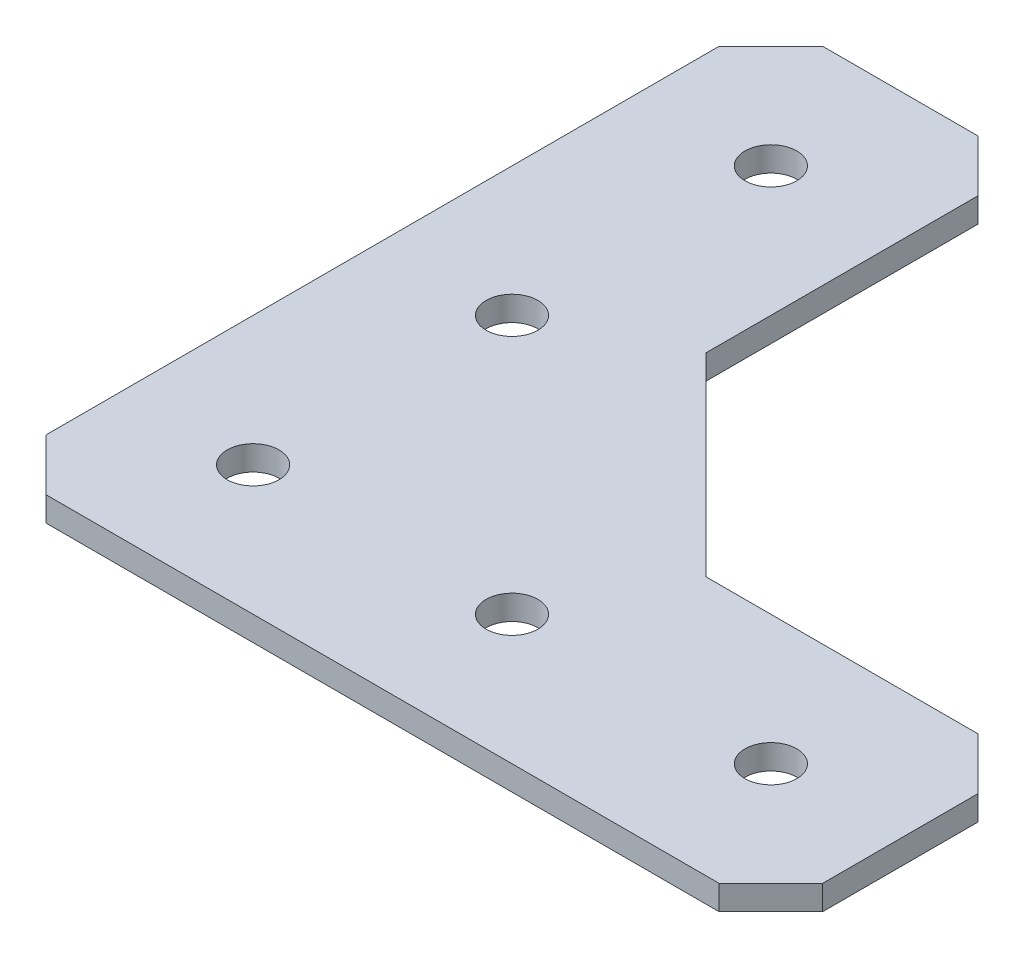
ISO-10303-21;
HEADER;
FILE_DESCRIPTION(('STEP AP214'),'2;1');
FILE_NAME('part.step','',(''),(''),'','','');
FILE_SCHEMA(('AUTOMOTIVE_DESIGN { 1 0 10303 214 1 1 1 1 }'));
ENDSEC;
DATA;
#1=APPLICATION_CONTEXT('core data for automotive mechanical design processes');
#2=APPLICATION_PROTOCOL_DEFINITION('international standard','automotive_design',2000,#1);
#3=PRODUCT_CONTEXT('',#1,'mechanical');
#4=PRODUCT('Part','Part','',(#3));
#5=PRODUCT_RELATED_PRODUCT_CATEGORY('part','',(#4));
#6=PRODUCT_DEFINITION_FORMATION('','',#4);
#7=PRODUCT_DEFINITION_CONTEXT('part definition',#1,'design');
#8=PRODUCT_DEFINITION('design','',#6,#7);
#9=PRODUCT_DEFINITION_SHAPE('','',#8);
#10=(LENGTH_UNIT() NAMED_UNIT(*) SI_UNIT(.MILLI.,.METRE.));
#11=(NAMED_UNIT(*) PLANE_ANGLE_UNIT() SI_UNIT($,.RADIAN.));
#12=(NAMED_UNIT(*) SI_UNIT($,.STERADIAN.) SOLID_ANGLE_UNIT());
#13=UNCERTAINTY_MEASURE_WITH_UNIT(LENGTH_MEASURE(1.E-05),#10,'distance_accuracy_value','');
#14=(GEOMETRIC_REPRESENTATION_CONTEXT(3) GLOBAL_UNCERTAINTY_ASSIGNED_CONTEXT((#13)) GLOBAL_UNIT_ASSIGNED_CONTEXT((#10,
#11,#12)) REPRESENTATION_CONTEXT('',''));
#15=CARTESIAN_POINT('',(0.,0.,0.));
#16=DIRECTION('',(0.,0.,1.));
#17=DIRECTION('',(1.,0.,0.));
#18=AXIS2_PLACEMENT_3D('',#15,#16,#17);
#19=CARTESIAN_POINT('',(0.,2.413,0.));
#20=DIRECTION('',(1.,0.,0.));
#21=DIRECTION('',(0.,0.,-1.));
#22=AXIS2_PLACEMENT_3D('',#19,#20,#21);
#23=PLANE('',#22);
#24=DIRECTION('',(0.,0.,1.));
#25=VECTOR('',#24,1.);
#26=CARTESIAN_POINT('',(0.,2.413,0.));
#27=LINE('',#26,#25);
#28=CARTESIAN_POINT('',(0.,2.413,-71.12));
#29=VERTEX_POINT('',#28);
#30=CARTESIAN_POINT('',(0.,2.413,-5.08000000000001));
#31=VERTEX_POINT('',#30);
#32=EDGE_CURVE('E161',#29,#31,#27,.T.);
#33=ORIENTED_EDGE('',*,*,#32,.F.);
#34=DIRECTION('',(0.,-1.,0.));
#35=VECTOR('',#34,1.);
#36=CARTESIAN_POINT('',(0.,2.413,-71.12));
#37=LINE('',#36,#35);
#38=CARTESIAN_POINT('',(0.,0.,-71.12));
#39=VERTEX_POINT('',#38);
#40=EDGE_CURVE('E171',#29,#39,#37,.T.);
#41=ORIENTED_EDGE('',*,*,#40,.T.);
#42=DIRECTION('',(0.,0.,1.));
#43=VECTOR('',#42,1.);
#44=CARTESIAN_POINT('',(0.,0.,0.));
#45=LINE('',#44,#43);
#46=CARTESIAN_POINT('',(0.,0.,-5.08000000000001));
#47=VERTEX_POINT('',#46);
#48=EDGE_CURVE('E222',#39,#47,#45,.T.);
#49=ORIENTED_EDGE('',*,*,#48,.T.);
#50=DIRECTION('',(0.,1.,0.));
#51=VECTOR('',#50,1.);
#52=CARTESIAN_POINT('',(0.,2.413,-5.08000000000002));
#53=LINE('',#52,#51);
#54=EDGE_CURVE('E169',#47,#31,#53,.T.);
#55=ORIENTED_EDGE('',*,*,#54,.T.);
#56=EDGE_LOOP('',(#33,#41,#49,#55));
#57=FACE_BOUND('',#56,.T.);
#58=ADVANCED_FACE('F41',(#57),#23,.F.);
#59=CARTESIAN_POINT('',(0.,2.413,0.));
#60=DIRECTION('',(0.,0.,-1.));
#61=DIRECTION('',(-1.,0.,0.));
#62=AXIS2_PLACEMENT_3D('',#59,#60,#61);
#63=PLANE('',#62);
#64=DIRECTION('',(1.,0.,0.));
#65=VECTOR('',#64,1.);
#66=CARTESIAN_POINT('',(0.,0.,0.));
#67=LINE('',#66,#65);
#68=CARTESIAN_POINT('',(5.08,0.,0.));
#69=VERTEX_POINT('',#68);
#70=CARTESIAN_POINT('',(71.12,0.,0.));
#71=VERTEX_POINT('',#70);
#72=EDGE_CURVE('E226',#69,#71,#67,.T.);
#73=ORIENTED_EDGE('',*,*,#72,.T.);
#74=DIRECTION('',(0.,1.,0.));
#75=VECTOR('',#74,1.);
#76=CARTESIAN_POINT('',(71.12,2.413,0.));
#77=LINE('',#76,#75);
#78=CARTESIAN_POINT('',(71.12,2.413,0.));
#79=VERTEX_POINT('',#78);
#80=EDGE_CURVE('E11',#71,#79,#77,.T.);
#81=ORIENTED_EDGE('',*,*,#80,.T.);
#82=DIRECTION('',(1.,0.,0.));
#83=VECTOR('',#82,1.);
#84=CARTESIAN_POINT('',(0.,2.413,0.));
#85=LINE('',#84,#83);
#86=CARTESIAN_POINT('',(5.08,2.413,0.));
#87=VERTEX_POINT('',#86);
#88=EDGE_CURVE('E249',#87,#79,#85,.T.);
#89=ORIENTED_EDGE('',*,*,#88,.F.);
#90=DIRECTION('',(0.,-1.,0.));
#91=VECTOR('',#90,1.);
#92=CARTESIAN_POINT('',(5.08,2.413,0.));
#93=LINE('',#92,#91);
#94=EDGE_CURVE('E51',#87,#69,#93,.T.);
#95=ORIENTED_EDGE('',*,*,#94,.T.);
#96=EDGE_LOOP('',(#73,#81,#89,#95));
#97=FACE_BOUND('',#96,.T.);
#98=ADVANCED_FACE('F299',(#97),#63,.F.);
#99=CARTESIAN_POINT('',(76.2,2.413,0.));
#100=DIRECTION('',(-1.,0.,0.));
#101=DIRECTION('',(0.,0.,1.));
#102=AXIS2_PLACEMENT_3D('',#99,#100,#101);
#103=PLANE('',#102);
#104=DIRECTION('',(0.,0.,-1.));
#105=VECTOR('',#104,1.);
#106=CARTESIAN_POINT('',(76.2,0.,0.));
#107=LINE('',#106,#105);
#108=CARTESIAN_POINT('',(76.2,0.,-5.08));
#109=VERTEX_POINT('',#108);
#110=CARTESIAN_POINT('',(76.2,0.,-20.32));
#111=VERTEX_POINT('',#110);
#112=EDGE_CURVE('E163',#109,#111,#107,.T.);
#113=ORIENTED_EDGE('',*,*,#112,.T.);
#114=DIRECTION('',(0.,1.,0.));
#115=VECTOR('',#114,1.);
#116=CARTESIAN_POINT('',(76.2,2.413,-20.32));
#117=LINE('',#116,#115);
#118=CARTESIAN_POINT('',(76.2,2.413,-20.32));
#119=VERTEX_POINT('',#118);
#120=EDGE_CURVE('E204',#111,#119,#117,.T.);
#121=ORIENTED_EDGE('',*,*,#120,.T.);
#122=DIRECTION('',(0.,0.,-1.));
#123=VECTOR('',#122,1.);
#124=CARTESIAN_POINT('',(76.2,2.413,0.));
#125=LINE('',#124,#123);
#126=CARTESIAN_POINT('',(76.2,2.413,-5.08));
#127=VERTEX_POINT('',#126);
#128=EDGE_CURVE('E247',#127,#119,#125,.T.);
#129=ORIENTED_EDGE('',*,*,#128,.F.);
#130=DIRECTION('',(0.,-1.,0.));
#131=VECTOR('',#130,1.);
#132=CARTESIAN_POINT('',(76.2,2.413,-5.08));
#133=LINE('',#132,#131);
#134=EDGE_CURVE('E201',#127,#109,#133,.T.);
#135=ORIENTED_EDGE('',*,*,#134,.T.);
#136=EDGE_LOOP('',(#113,#121,#129,#135));
#137=FACE_BOUND('',#136,.T.);
#138=ADVANCED_FACE('F238',(#137),#103,.F.);
#139=CARTESIAN_POINT('',(25.4,2.413,-25.4));
#140=DIRECTION('',(0.,0.,1.));
#141=DIRECTION('',(1.,0.,0.));
#142=AXIS2_PLACEMENT_3D('',#139,#140,#141);
#143=PLANE('',#142);
#144=DIRECTION('',(-1.,0.,0.));
#145=VECTOR('',#144,1.);
#146=CARTESIAN_POINT('',(25.4,2.413,-25.4));
#147=LINE('',#146,#145);
#148=CARTESIAN_POINT('',(71.12,2.413,-25.4));
#149=VERTEX_POINT('',#148);
#150=CARTESIAN_POINT('',(44.4499999999999,2.413,-25.4));
#151=VERTEX_POINT('',#150);
#152=EDGE_CURVE('E246',#149,#151,#147,.T.);
#153=ORIENTED_EDGE('',*,*,#152,.F.);
#154=DIRECTION('',(0.,-1.,0.));
#155=VECTOR('',#154,1.);
#156=CARTESIAN_POINT('',(71.12,2.413,-25.4));
#157=LINE('',#156,#155);
#158=CARTESIAN_POINT('',(71.12,0.,-25.4));
#159=VERTEX_POINT('',#158);
#160=EDGE_CURVE('E198',#149,#159,#157,.T.);
#161=ORIENTED_EDGE('',*,*,#160,.T.);
#162=DIRECTION('',(-1.,0.,0.));
#163=VECTOR('',#162,1.);
#164=CARTESIAN_POINT('',(25.4,0.,-25.4));
#165=LINE('',#164,#163);
#166=CARTESIAN_POINT('',(44.4499999999999,0.,-25.4));
#167=VERTEX_POINT('',#166);
#168=EDGE_CURVE('E158',#159,#167,#165,.T.);
#169=ORIENTED_EDGE('',*,*,#168,.T.);
#170=DIRECTION('',(0.,1.,0.));
#171=VECTOR('',#170,1.);
#172=CARTESIAN_POINT('',(44.4499999999999,2.413,-25.4));
#173=LINE('',#172,#171);
#174=EDGE_CURVE('E142',#167,#151,#173,.T.);
#175=ORIENTED_EDGE('',*,*,#174,.T.);
#176=EDGE_LOOP('',(#153,#161,#169,#175));
#177=FACE_BOUND('',#176,.T.);
#178=ADVANCED_FACE('F245',(#177),#143,.F.);
#179=CARTESIAN_POINT('',(25.4,2.413,-76.2));
#180=DIRECTION('',(-1.,0.,0.));
#181=DIRECTION('',(0.,0.,1.));
#182=AXIS2_PLACEMENT_3D('',#179,#180,#181);
#183=PLANE('',#182);
#184=DIRECTION('',(0.,0.,-1.));
#185=VECTOR('',#184,1.);
#186=CARTESIAN_POINT('',(25.4,0.,-76.2));
#187=LINE('',#186,#185);
#188=CARTESIAN_POINT('',(25.4,0.,-44.4500000000001));
#189=VERTEX_POINT('',#188);
#190=CARTESIAN_POINT('',(25.4,0.,-71.12));
#191=VERTEX_POINT('',#190);
#192=EDGE_CURVE('E149',#189,#191,#187,.T.);
#193=ORIENTED_EDGE('',*,*,#192,.T.);
#194=DIRECTION('',(0.,1.,0.));
#195=VECTOR('',#194,1.);
#196=CARTESIAN_POINT('',(25.4,2.413,-71.12));
#197=LINE('',#196,#195);
#198=CARTESIAN_POINT('',(25.4,2.413,-71.12));
#199=VERTEX_POINT('',#198);
#200=EDGE_CURVE('E59',#191,#199,#197,.T.);
#201=ORIENTED_EDGE('',*,*,#200,.T.);
#202=DIRECTION('',(0.,0.,-1.));
#203=VECTOR('',#202,1.);
#204=CARTESIAN_POINT('',(25.4,2.413,-76.2));
#205=LINE('',#204,#203);
#206=CARTESIAN_POINT('',(25.4,2.413,-44.4500000000001));
#207=VERTEX_POINT('',#206);
#208=EDGE_CURVE('E150',#207,#199,#205,.T.);
#209=ORIENTED_EDGE('',*,*,#208,.F.);
#210=DIRECTION('',(0.,-1.,0.));
#211=VECTOR('',#210,1.);
#212=CARTESIAN_POINT('',(25.4,0.,-44.4500000000001));
#213=LINE('',#212,#211);
#214=EDGE_CURVE('E140',#207,#189,#213,.T.);
#215=ORIENTED_EDGE('',*,*,#214,.T.);
#216=EDGE_LOOP('',(#193,#201,#209,#215));
#217=FACE_BOUND('',#216,.T.);
#218=ADVANCED_FACE('F148',(#217),#183,.F.);
#219=CARTESIAN_POINT('',(0.,2.413,-76.2));
#220=DIRECTION('',(0.,0.,1.));
#221=DIRECTION('',(1.,0.,0.));
#222=AXIS2_PLACEMENT_3D('',#219,#220,#221);
#223=PLANE('',#222);
#224=DIRECTION('',(-1.,0.,0.));
#225=VECTOR('',#224,1.);
#226=CARTESIAN_POINT('',(0.,0.,-76.2));
#227=LINE('',#226,#225);
#228=CARTESIAN_POINT('',(20.32,0.,-76.2));
#229=VERTEX_POINT('',#228);
#230=CARTESIAN_POINT('',(5.08000000000002,0.,-76.2));
#231=VERTEX_POINT('',#230);
#232=EDGE_CURVE('E157',#229,#231,#227,.T.);
#233=ORIENTED_EDGE('',*,*,#232,.T.);
#234=DIRECTION('',(0.,1.,0.));
#235=VECTOR('',#234,1.);
#236=CARTESIAN_POINT('',(5.08000000000002,2.413,-76.2));
#237=LINE('',#236,#235);
#238=CARTESIAN_POINT('',(5.08000000000002,2.413,-76.2));
#239=VERTEX_POINT('',#238);
#240=EDGE_CURVE('E186',#231,#239,#237,.T.);
#241=ORIENTED_EDGE('',*,*,#240,.T.);
#242=DIRECTION('',(-1.,0.,0.));
#243=VECTOR('',#242,1.);
#244=CARTESIAN_POINT('',(0.,2.413,-76.2));
#245=LINE('',#244,#243);
#246=CARTESIAN_POINT('',(20.32,2.413,-76.2));
#247=VERTEX_POINT('',#246);
#248=EDGE_CURVE('E151',#247,#239,#245,.T.);
#249=ORIENTED_EDGE('',*,*,#248,.F.);
#250=DIRECTION('',(0.,-1.,0.));
#251=VECTOR('',#250,1.);
#252=CARTESIAN_POINT('',(20.32,2.413,-76.2));
#253=LINE('',#252,#251);
#254=EDGE_CURVE('E183',#247,#229,#253,.T.);
#255=ORIENTED_EDGE('',*,*,#254,.T.);
#256=EDGE_LOOP('',(#233,#241,#249,#255));
#257=FACE_BOUND('',#256,.T.);
#258=ADVANCED_FACE('F276',(#257),#223,.F.);
#259=CARTESIAN_POINT('',(0.,2.413,0.));
#260=DIRECTION('',(0.,-1.,0.));
#261=DIRECTION('',(0.,0.,-1.));
#262=AXIS2_PLACEMENT_3D('',#259,#260,#261);
#263=PLANE('',#262);
#264=CARTESIAN_POINT('',(12.7,2.413,-38.1));
#265=DIRECTION('',(0.,1.,0.));
#266=DIRECTION('',(0.,0.,1.));
#267=AXIS2_PLACEMENT_3D('',#264,#265,#266);
#268=CIRCLE('',#267,2.54);
#269=CARTESIAN_POINT('',(12.7,2.413,-35.56));
#270=VERTEX_POINT('',#269);
#271=EDGE_CURVE('E258',#270,#270,#268,.T.);
#272=ORIENTED_EDGE('',*,*,#271,.F.);
#273=EDGE_LOOP('',(#272));
#274=FACE_BOUND('',#273,.T.);
#275=CARTESIAN_POINT('',(38.1,2.413,-12.7));
#276=DIRECTION('',(0.,1.,0.));
#277=DIRECTION('',(0.,0.,1.));
#278=AXIS2_PLACEMENT_3D('',#275,#276,#277);
#279=CIRCLE('',#278,2.54);
#280=CARTESIAN_POINT('',(38.1,2.413,-10.16));
#281=VERTEX_POINT('',#280);
#282=EDGE_CURVE('E259',#281,#281,#279,.T.);
#283=ORIENTED_EDGE('',*,*,#282,.F.);
#284=EDGE_LOOP('',(#283));
#285=FACE_BOUND('',#284,.T.);
#286=CARTESIAN_POINT('',(12.7,2.413,-63.5));
#287=DIRECTION('',(0.,1.,0.));
#288=DIRECTION('',(0.,0.,1.));
#289=AXIS2_PLACEMENT_3D('',#286,#287,#288);
#290=CIRCLE('',#289,2.54);
#291=CARTESIAN_POINT('',(12.7,2.413,-60.96));
#292=VERTEX_POINT('',#291);
#293=EDGE_CURVE('E262',#292,#292,#290,.T.);
#294=ORIENTED_EDGE('',*,*,#293,.F.);
#295=EDGE_LOOP('',(#294));
#296=FACE_BOUND('',#295,.T.);
#297=CARTESIAN_POINT('',(63.5,2.413,-12.7));
#298=DIRECTION('',(0.,1.,0.));
#299=DIRECTION('',(0.,0.,1.));
#300=AXIS2_PLACEMENT_3D('',#297,#298,#299);
#301=CIRCLE('',#300,2.54);
#302=CARTESIAN_POINT('',(63.5,2.413,-10.16));
#303=VERTEX_POINT('',#302);
#304=EDGE_CURVE('E265',#303,#303,#301,.T.);
#305=ORIENTED_EDGE('',*,*,#304,.F.);
#306=EDGE_LOOP('',(#305));
#307=FACE_BOUND('',#306,.T.);
#308=CARTESIAN_POINT('',(12.7,2.413,-12.7));
#309=DIRECTION('',(0.,1.,0.));
#310=DIRECTION('',(0.,0.,1.));
#311=AXIS2_PLACEMENT_3D('',#308,#309,#310);
#312=CIRCLE('',#311,2.54);
#313=CARTESIAN_POINT('',(12.7,2.413,-10.16));
#314=VERTEX_POINT('',#313);
#315=EDGE_CURVE('E212',#314,#314,#312,.T.);
#316=ORIENTED_EDGE('',*,*,#315,.F.);
#317=EDGE_LOOP('',(#316));
#318=FACE_BOUND('',#317,.T.);
#319=ORIENTED_EDGE('',*,*,#248,.T.);
#320=DIRECTION('',(0.707106781186548,0.,-0.707106781186547));
#321=VECTOR('',#320,1.);
#322=CARTESIAN_POINT('',(0.,2.413,-71.12));
#323=LINE('',#322,#321);
#324=EDGE_CURVE('E195',#239,#29,#323,.F.);
#325=ORIENTED_EDGE('',*,*,#324,.T.);
#326=ORIENTED_EDGE('',*,*,#32,.T.);
#327=DIRECTION('',(-0.707106781186547,0.,-0.707106781186548));
#328=VECTOR('',#327,1.);
#329=CARTESIAN_POINT('',(5.08,2.413,0.));
#330=LINE('',#329,#328);
#331=EDGE_CURVE('E188',#31,#87,#330,.F.);
#332=ORIENTED_EDGE('',*,*,#331,.T.);
#333=ORIENTED_EDGE('',*,*,#88,.T.);
#334=DIRECTION('',(-0.707106781186548,0.,0.707106781186547));
#335=VECTOR('',#334,1.);
#336=CARTESIAN_POINT('',(76.2,2.413,-5.08));
#337=LINE('',#336,#335);
#338=EDGE_CURVE('E190',#79,#127,#337,.F.);
#339=ORIENTED_EDGE('',*,*,#338,.T.);
#340=ORIENTED_EDGE('',*,*,#128,.T.);
#341=DIRECTION('',(0.707106781186547,0.,0.707106781186548));
#342=VECTOR('',#341,1.);
#343=CARTESIAN_POINT('',(71.12,2.413,-25.4));
#344=LINE('',#343,#342);
#345=EDGE_CURVE('E67',#119,#149,#344,.F.);
#346=ORIENTED_EDGE('',*,*,#345,.T.);
#347=ORIENTED_EDGE('',*,*,#152,.T.);
#348=DIRECTION('',(0.707106781186543,0.,0.707106781186552));
#349=VECTOR('',#348,1.);
#350=CARTESIAN_POINT('',(34.9250000000002,2.413,-34.9249999999998));
#351=LINE('',#350,#349);
#352=EDGE_CURVE('E146',#151,#207,#351,.F.);
#353=ORIENTED_EDGE('',*,*,#352,.T.);
#354=ORIENTED_EDGE('',*,*,#208,.T.);
#355=DIRECTION('',(0.707106781186547,0.,0.707106781186548));
#356=VECTOR('',#355,1.);
#357=CARTESIAN_POINT('',(20.32,2.413,-76.2));
#358=LINE('',#357,#356);
#359=EDGE_CURVE('E193',#199,#247,#358,.F.);
#360=ORIENTED_EDGE('',*,*,#359,.T.);
#361=EDGE_LOOP('',(#319,#325,#326,#332,#333,#339,#340,#346,#347,#353,#354,#360));
#362=FACE_BOUND('',#361,.T.);
#363=ADVANCED_FACE('F273',(#274,#285,#296,#307,#318,#362),#263,.F.);
#364=CARTESIAN_POINT('',(0.,0.,0.));
#365=DIRECTION('',(0.,-1.,0.));
#366=DIRECTION('',(0.,0.,-1.));
#367=AXIS2_PLACEMENT_3D('',#364,#365,#366);
#368=PLANE('',#367);
#369=CARTESIAN_POINT('',(12.7,0.,-38.1));
#370=DIRECTION('',(0.,-1.,0.));
#371=DIRECTION('',(0.,0.,-1.));
#372=AXIS2_PLACEMENT_3D('',#369,#370,#371);
#373=CIRCLE('',#372,2.54);
#374=CARTESIAN_POINT('',(12.7,0.,-35.56));
#375=VERTEX_POINT('',#374);
#376=EDGE_CURVE('E46',#375,#375,#373,.T.);
#377=ORIENTED_EDGE('',*,*,#376,.F.);
#378=EDGE_LOOP('',(#377));
#379=FACE_BOUND('',#378,.T.);
#380=CARTESIAN_POINT('',(38.1,0.,-12.7));
#381=DIRECTION('',(0.,-1.,0.));
#382=DIRECTION('',(0.,0.,-1.));
#383=AXIS2_PLACEMENT_3D('',#380,#381,#382);
#384=CIRCLE('',#383,2.54);
#385=CARTESIAN_POINT('',(38.1,0.,-10.16));
#386=VERTEX_POINT('',#385);
#387=EDGE_CURVE('E217',#386,#386,#384,.T.);
#388=ORIENTED_EDGE('',*,*,#387,.F.);
#389=EDGE_LOOP('',(#388));
#390=FACE_BOUND('',#389,.T.);
#391=CARTESIAN_POINT('',(12.7,0.,-63.5));
#392=DIRECTION('',(0.,-1.,0.));
#393=DIRECTION('',(0.,0.,-1.));
#394=AXIS2_PLACEMENT_3D('',#391,#392,#393);
#395=CIRCLE('',#394,2.54);
#396=CARTESIAN_POINT('',(12.7,0.,-60.96));
#397=VERTEX_POINT('',#396);
#398=EDGE_CURVE('E215',#397,#397,#395,.T.);
#399=ORIENTED_EDGE('',*,*,#398,.F.);
#400=EDGE_LOOP('',(#399));
#401=FACE_BOUND('',#400,.T.);
#402=CARTESIAN_POINT('',(63.5,0.,-12.7));
#403=DIRECTION('',(0.,-1.,0.));
#404=DIRECTION('',(0.,0.,-1.));
#405=AXIS2_PLACEMENT_3D('',#402,#403,#404);
#406=CIRCLE('',#405,2.54);
#407=CARTESIAN_POINT('',(63.5,0.,-10.16));
#408=VERTEX_POINT('',#407);
#409=EDGE_CURVE('E211',#408,#408,#406,.T.);
#410=ORIENTED_EDGE('',*,*,#409,.F.);
#411=EDGE_LOOP('',(#410));
#412=FACE_BOUND('',#411,.T.);
#413=CARTESIAN_POINT('',(12.7,0.,-12.7));
#414=DIRECTION('',(0.,-1.,0.));
#415=DIRECTION('',(0.,0.,-1.));
#416=AXIS2_PLACEMENT_3D('',#413,#414,#415);
#417=CIRCLE('',#416,2.54);
#418=CARTESIAN_POINT('',(12.7,0.,-10.16));
#419=VERTEX_POINT('',#418);
#420=EDGE_CURVE('E208',#419,#419,#417,.T.);
#421=ORIENTED_EDGE('',*,*,#420,.F.);
#422=EDGE_LOOP('',(#421));
#423=FACE_BOUND('',#422,.T.);
#424=ORIENTED_EDGE('',*,*,#48,.F.);
#425=DIRECTION('',(-0.707106781186548,0.,0.707106781186547));
#426=VECTOR('',#425,1.);
#427=CARTESIAN_POINT('',(-35.56,0.,-35.5600000000001));
#428=LINE('',#427,#426);
#429=EDGE_CURVE('E181',#39,#231,#428,.F.);
#430=ORIENTED_EDGE('',*,*,#429,.T.);
#431=ORIENTED_EDGE('',*,*,#232,.F.);
#432=DIRECTION('',(-0.707106781186547,0.,-0.707106781186548));
#433=VECTOR('',#432,1.);
#434=CARTESIAN_POINT('',(48.26,0.,-48.2599999999999));
#435=LINE('',#434,#433);
#436=EDGE_CURVE('E156',#229,#191,#435,.F.);
#437=ORIENTED_EDGE('',*,*,#436,.T.);
#438=ORIENTED_EDGE('',*,*,#192,.F.);
#439=DIRECTION('',(-0.707106781186543,0.,-0.707106781186552));
#440=VECTOR('',#439,1.);
#441=CARTESIAN_POINT('',(25.4,0.,-44.4500000000001));
#442=LINE('',#441,#440);
#443=EDGE_CURVE('E136',#189,#167,#442,.F.);
#444=ORIENTED_EDGE('',*,*,#443,.T.);
#445=ORIENTED_EDGE('',*,*,#168,.F.);
#446=DIRECTION('',(-0.707106781186547,0.,-0.707106781186548));
#447=VECTOR('',#446,1.);
#448=CARTESIAN_POINT('',(48.2600000000001,0.,-48.26));
#449=LINE('',#448,#447);
#450=EDGE_CURVE('E178',#159,#111,#449,.F.);
#451=ORIENTED_EDGE('',*,*,#450,.T.);
#452=ORIENTED_EDGE('',*,*,#112,.F.);
#453=DIRECTION('',(0.707106781186548,0.,-0.707106781186547));
#454=VECTOR('',#453,1.);
#455=CARTESIAN_POINT('',(35.5599999999999,0.,35.56));
#456=LINE('',#455,#454);
#457=EDGE_CURVE('E176',#109,#71,#456,.F.);
#458=ORIENTED_EDGE('',*,*,#457,.T.);
#459=ORIENTED_EDGE('',*,*,#72,.F.);
#460=DIRECTION('',(0.707106781186547,0.,0.707106781186548));
#461=VECTOR('',#460,1.);
#462=CARTESIAN_POINT('',(2.54000000000001,0.,-2.54));
#463=LINE('',#462,#461);
#464=EDGE_CURVE('E174',#69,#47,#463,.F.);
#465=ORIENTED_EDGE('',*,*,#464,.T.);
#466=EDGE_LOOP('',(#424,#430,#431,#437,#438,#444,#445,#451,#452,#458,#459,#465));
#467=FACE_BOUND('',#466,.T.);
#468=ADVANCED_FACE('F154',(#379,#390,#401,#412,#423,#467),#368,.T.);
#469=CARTESIAN_POINT('',(25.4,2.413,-44.4500000000001));
#470=DIRECTION('',(0.707106781186552,0.,-0.707106781186543));
#471=DIRECTION('',(0.,1.,0.));
#472=AXIS2_PLACEMENT_3D('',#469,#470,#471);
#473=PLANE('',#472);
#474=ORIENTED_EDGE('',*,*,#352,.F.);
#475=ORIENTED_EDGE('',*,*,#174,.F.);
#476=ORIENTED_EDGE('',*,*,#443,.F.);
#477=ORIENTED_EDGE('',*,*,#214,.F.);
#478=EDGE_LOOP('',(#474,#475,#476,#477));
#479=FACE_BOUND('',#478,.T.);
#480=ADVANCED_FACE('F139',(#479),#473,.T.);
#481=CARTESIAN_POINT('',(0.,2.413,-71.12));
#482=DIRECTION('',(0.707106781186547,0.,0.707106781186548));
#483=DIRECTION('',(0.,-1.,0.));
#484=AXIS2_PLACEMENT_3D('',#481,#482,#483);
#485=PLANE('',#484);
#486=ORIENTED_EDGE('',*,*,#324,.F.);
#487=ORIENTED_EDGE('',*,*,#240,.F.);
#488=ORIENTED_EDGE('',*,*,#429,.F.);
#489=ORIENTED_EDGE('',*,*,#40,.F.);
#490=EDGE_LOOP('',(#486,#487,#488,#489));
#491=FACE_BOUND('',#490,.T.);
#492=ADVANCED_FACE('F292',(#491),#485,.F.);
#493=CARTESIAN_POINT('',(20.32,2.413,-76.2));
#494=DIRECTION('',(-0.707106781186548,0.,0.707106781186547));
#495=DIRECTION('',(0.,-1.,0.));
#496=AXIS2_PLACEMENT_3D('',#493,#494,#495);
#497=PLANE('',#496);
#498=ORIENTED_EDGE('',*,*,#359,.F.);
#499=ORIENTED_EDGE('',*,*,#200,.F.);
#500=ORIENTED_EDGE('',*,*,#436,.F.);
#501=ORIENTED_EDGE('',*,*,#254,.F.);
#502=EDGE_LOOP('',(#498,#499,#500,#501));
#503=FACE_BOUND('',#502,.T.);
#504=ADVANCED_FACE('F310',(#503),#497,.F.);
#505=CARTESIAN_POINT('',(71.12,2.413,-25.4));
#506=DIRECTION('',(-0.707106781186548,0.,0.707106781186547));
#507=DIRECTION('',(0.,-1.,0.));
#508=AXIS2_PLACEMENT_3D('',#505,#506,#507);
#509=PLANE('',#508);
#510=ORIENTED_EDGE('',*,*,#345,.F.);
#511=ORIENTED_EDGE('',*,*,#120,.F.);
#512=ORIENTED_EDGE('',*,*,#450,.F.);
#513=ORIENTED_EDGE('',*,*,#160,.F.);
#514=EDGE_LOOP('',(#510,#511,#512,#513));
#515=FACE_BOUND('',#514,.T.);
#516=ADVANCED_FACE('F242',(#515),#509,.F.);
#517=CARTESIAN_POINT('',(76.2,2.413,-5.08));
#518=DIRECTION('',(-0.707106781186547,0.,-0.707106781186548));
#519=DIRECTION('',(0.,-1.,0.));
#520=AXIS2_PLACEMENT_3D('',#517,#518,#519);
#521=PLANE('',#520);
#522=ORIENTED_EDGE('',*,*,#338,.F.);
#523=ORIENTED_EDGE('',*,*,#80,.F.);
#524=ORIENTED_EDGE('',*,*,#457,.F.);
#525=ORIENTED_EDGE('',*,*,#134,.F.);
#526=EDGE_LOOP('',(#522,#523,#524,#525));
#527=FACE_BOUND('',#526,.T.);
#528=ADVANCED_FACE('F303',(#527),#521,.F.);
#529=CARTESIAN_POINT('',(5.08,2.413,0.));
#530=DIRECTION('',(0.707106781186548,0.,-0.707106781186547));
#531=DIRECTION('',(0.,-1.,0.));
#532=AXIS2_PLACEMENT_3D('',#529,#530,#531);
#533=PLANE('',#532);
#534=ORIENTED_EDGE('',*,*,#331,.F.);
#535=ORIENTED_EDGE('',*,*,#54,.F.);
#536=ORIENTED_EDGE('',*,*,#464,.F.);
#537=ORIENTED_EDGE('',*,*,#94,.F.);
#538=EDGE_LOOP('',(#534,#535,#536,#537));
#539=FACE_BOUND('',#538,.T.);
#540=ADVANCED_FACE('F44',(#539),#533,.F.);
#541=CARTESIAN_POINT('',(12.7,-1.2E-05,-12.7));
#542=DIRECTION('',(0.,1.,0.));
#543=DIRECTION('',(0.,0.,1.));
#544=AXIS2_PLACEMENT_3D('',#541,#542,#543);
#545=CYLINDRICAL_SURFACE('',#544,2.54);
#546=CARTESIAN_POINT('',(12.7,0.,-10.16));
#547=CARTESIAN_POINT('',(12.7,0.0251354166666667,-10.16));
#548=CARTESIAN_POINT('',(12.7,0.0502708333333333,-10.16));
#549=CARTESIAN_POINT('',(12.7,0.100541666666667,-10.16));
#550=CARTESIAN_POINT('',(12.7,0.125677083333333,-10.16));
#551=CARTESIAN_POINT('',(12.7,0.175947916666667,-10.16));
#552=CARTESIAN_POINT('',(12.7,0.201083333333333,-10.16));
#553=CARTESIAN_POINT('',(12.7,0.251354166666667,-10.16));
#554=CARTESIAN_POINT('',(12.7,0.276489583333333,-10.16));
#555=CARTESIAN_POINT('',(12.7,0.326760416666667,-10.16));
#556=CARTESIAN_POINT('',(12.7,0.351895833333333,-10.16));
#557=CARTESIAN_POINT('',(12.7,0.402166666666667,-10.16));
#558=CARTESIAN_POINT('',(12.7,0.427302083333333,-10.16));
#559=CARTESIAN_POINT('',(12.7,0.477572916666667,-10.16));
#560=CARTESIAN_POINT('',(12.7,0.502708333333333,-10.16));
#561=CARTESIAN_POINT('',(12.7,0.552979166666667,-10.16));
#562=CARTESIAN_POINT('',(12.7,0.578114583333333,-10.16));
#563=CARTESIAN_POINT('',(12.7,0.628385416666666,-10.16));
#564=CARTESIAN_POINT('',(12.7,0.653520833333333,-10.16));
#565=CARTESIAN_POINT('',(12.7,0.703791666666666,-10.16));
#566=CARTESIAN_POINT('',(12.7,0.728927083333333,-10.16));
#567=CARTESIAN_POINT('',(12.7,0.779197916666666,-10.16));
#568=CARTESIAN_POINT('',(12.7,0.804333333333333,-10.16));
#569=CARTESIAN_POINT('',(12.7,0.854604166666666,-10.16));
#570=CARTESIAN_POINT('',(12.7,0.879739583333333,-10.16));
#571=CARTESIAN_POINT('',(12.7,0.930010416666666,-10.16));
#572=CARTESIAN_POINT('',(12.7,0.955145833333333,-10.16));
#573=CARTESIAN_POINT('',(12.7,1.00541666666667,-10.16));
#574=CARTESIAN_POINT('',(12.7,1.03055208333333,-10.16));
#575=CARTESIAN_POINT('',(12.7,1.08082291666667,-10.16));
#576=CARTESIAN_POINT('',(12.7,1.10595833333333,-10.16));
#577=CARTESIAN_POINT('',(12.7,1.15622916666667,-10.16));
#578=CARTESIAN_POINT('',(12.7,1.18136458333333,-10.16));
#579=CARTESIAN_POINT('',(12.7,1.23163541666667,-10.16));
#580=CARTESIAN_POINT('',(12.7,1.25677083333333,-10.16));
#581=CARTESIAN_POINT('',(12.7,1.30704166666667,-10.16));
#582=CARTESIAN_POINT('',(12.7,1.33217708333333,-10.16));
#583=CARTESIAN_POINT('',(12.7,1.38244791666667,-10.16));
#584=CARTESIAN_POINT('',(12.7,1.40758333333333,-10.16));
#585=CARTESIAN_POINT('',(12.7,1.45785416666667,-10.16));
#586=CARTESIAN_POINT('',(12.7,1.48298958333333,-10.16));
#587=CARTESIAN_POINT('',(12.7,1.53326041666667,-10.16));
#588=CARTESIAN_POINT('',(12.7,1.55839583333333,-10.16));
#589=CARTESIAN_POINT('',(12.7,1.60866666666667,-10.16));
#590=CARTESIAN_POINT('',(12.7,1.63380208333333,-10.16));
#591=CARTESIAN_POINT('',(12.7,1.68407291666667,-10.16));
#592=CARTESIAN_POINT('',(12.7,1.70920833333333,-10.16));
#593=CARTESIAN_POINT('',(12.7,1.75947916666667,-10.16));
#594=CARTESIAN_POINT('',(12.7,1.78461458333333,-10.16));
#595=CARTESIAN_POINT('',(12.7,1.83488541666667,-10.16));
#596=CARTESIAN_POINT('',(12.7,1.86002083333333,-10.16));
#597=CARTESIAN_POINT('',(12.7,1.91029166666667,-10.16));
#598=CARTESIAN_POINT('',(12.7,1.93542708333333,-10.16));
#599=CARTESIAN_POINT('',(12.7,1.98569791666667,-10.16));
#600=CARTESIAN_POINT('',(12.7,2.01083333333333,-10.16));
#601=CARTESIAN_POINT('',(12.7,2.06110416666667,-10.16));
#602=CARTESIAN_POINT('',(12.7,2.08623958333333,-10.16));
#603=CARTESIAN_POINT('',(12.7,2.13651041666667,-10.16));
#604=CARTESIAN_POINT('',(12.7,2.16164583333333,-10.16));
#605=CARTESIAN_POINT('',(12.7,2.21191666666667,-10.16));
#606=CARTESIAN_POINT('',(12.7,2.23705208333333,-10.16));
#607=CARTESIAN_POINT('',(12.7,2.28732291666667,-10.16));
#608=CARTESIAN_POINT('',(12.7,2.31245833333333,-10.16));
#609=CARTESIAN_POINT('',(12.7,2.36272916666667,-10.16));
#610=CARTESIAN_POINT('',(12.7,2.38786458333333,-10.16));
#611=CARTESIAN_POINT('',(12.7,2.413,-10.16));
#612=B_SPLINE_CURVE_WITH_KNOTS('',3,(#546,#547,#548,#549,#550,#551,#552,#553,#554,#555,#556,
#557,#558,#559,#560,#561,#562,#563,#564,#565,#566,#567,#568,#569,#570,#571,#572,#573,#574,#575,
#576,#577,#578,#579,#580,#581,#582,#583,#584,#585,#586,#587,#588,#589,#590,#591,#592,#593,#594,
#595,#596,#597,#598,#599,#600,#601,#602,#603,#604,#605,#606,#607,#608,#609,#610,#611),
.UNSPECIFIED.,.F.,.F.,(4,2,2,2,2,2,2,2,2,2,2,2,2,2,2,2,2,2,2,2,2,2,2,2,2,2,2,2,2,2,2,2,4),(0.,
0.07540625,0.1508125,0.22621875,0.301625,0.37703125,0.4524375,0.52784375,0.60325,0.67865625,
0.7540625,0.82946875,0.904875,0.98028125,1.0556875,1.13109375,1.2065,1.28190625,1.3573125,
1.43271875,1.508125,1.58353125,1.6589375,1.73434375,1.80975,1.88515625,1.9605625,2.03596875,
2.111375,2.18678125,2.2621875,2.33759375,2.413),.UNSPECIFIED.);
#613=EDGE_CURVE('BSEAM309',#419,#314,#612,.T.);
#614=ORIENTED_EDGE('',*,*,#420,.T.);
#615=ORIENTED_EDGE('',*,*,#315,.T.);
#616=ORIENTED_EDGE('',*,*,#613,.T.);
#617=ORIENTED_EDGE('',*,*,#613,.F.);
#618=EDGE_LOOP('',(#614,#616,#615,#617));
#619=FACE_BOUND('',#618,.T.);
#620=ADVANCED_FACE('F309',(#619),#545,.F.);
#621=CARTESIAN_POINT('',(63.5,-1.2E-05,-12.7));
#622=DIRECTION('',(0.,1.,0.));
#623=DIRECTION('',(0.,0.,1.));
#624=AXIS2_PLACEMENT_3D('',#621,#622,#623);
#625=CYLINDRICAL_SURFACE('',#624,2.54);
#626=CARTESIAN_POINT('',(63.5,0.,-10.16));
#627=CARTESIAN_POINT('',(63.5,0.0251354166666667,-10.16));
#628=CARTESIAN_POINT('',(63.5,0.0502708333333333,-10.16));
#629=CARTESIAN_POINT('',(63.5,0.100541666666667,-10.16));
#630=CARTESIAN_POINT('',(63.5,0.125677083333333,-10.16));
#631=CARTESIAN_POINT('',(63.5,0.175947916666667,-10.16));
#632=CARTESIAN_POINT('',(63.5,0.201083333333333,-10.16));
#633=CARTESIAN_POINT('',(63.5,0.251354166666667,-10.16));
#634=CARTESIAN_POINT('',(63.5,0.276489583333333,-10.16));
#635=CARTESIAN_POINT('',(63.5,0.326760416666667,-10.16));
#636=CARTESIAN_POINT('',(63.5,0.351895833333333,-10.16));
#637=CARTESIAN_POINT('',(63.5,0.402166666666667,-10.16));
#638=CARTESIAN_POINT('',(63.5,0.427302083333333,-10.16));
#639=CARTESIAN_POINT('',(63.5,0.477572916666667,-10.16));
#640=CARTESIAN_POINT('',(63.5,0.502708333333333,-10.16));
#641=CARTESIAN_POINT('',(63.5,0.552979166666667,-10.16));
#642=CARTESIAN_POINT('',(63.5,0.578114583333333,-10.16));
#643=CARTESIAN_POINT('',(63.5,0.628385416666666,-10.16));
#644=CARTESIAN_POINT('',(63.5,0.653520833333333,-10.16));
#645=CARTESIAN_POINT('',(63.5,0.703791666666666,-10.16));
#646=CARTESIAN_POINT('',(63.5,0.728927083333333,-10.16));
#647=CARTESIAN_POINT('',(63.5,0.779197916666666,-10.16));
#648=CARTESIAN_POINT('',(63.5,0.804333333333333,-10.16));
#649=CARTESIAN_POINT('',(63.5,0.854604166666666,-10.16));
#650=CARTESIAN_POINT('',(63.5,0.879739583333333,-10.16));
#651=CARTESIAN_POINT('',(63.5,0.930010416666666,-10.16));
#652=CARTESIAN_POINT('',(63.5,0.955145833333333,-10.16));
#653=CARTESIAN_POINT('',(63.5,1.00541666666667,-10.16));
#654=CARTESIAN_POINT('',(63.5,1.03055208333333,-10.16));
#655=CARTESIAN_POINT('',(63.5,1.08082291666667,-10.16));
#656=CARTESIAN_POINT('',(63.5,1.10595833333333,-10.16));
#657=CARTESIAN_POINT('',(63.5,1.15622916666667,-10.16));
#658=CARTESIAN_POINT('',(63.5,1.18136458333333,-10.16));
#659=CARTESIAN_POINT('',(63.5,1.23163541666667,-10.16));
#660=CARTESIAN_POINT('',(63.5,1.25677083333333,-10.16));
#661=CARTESIAN_POINT('',(63.5,1.30704166666667,-10.16));
#662=CARTESIAN_POINT('',(63.5,1.33217708333333,-10.16));
#663=CARTESIAN_POINT('',(63.5,1.38244791666667,-10.16));
#664=CARTESIAN_POINT('',(63.5,1.40758333333333,-10.16));
#665=CARTESIAN_POINT('',(63.5,1.45785416666667,-10.16));
#666=CARTESIAN_POINT('',(63.5,1.48298958333333,-10.16));
#667=CARTESIAN_POINT('',(63.5,1.53326041666667,-10.16));
#668=CARTESIAN_POINT('',(63.5,1.55839583333333,-10.16));
#669=CARTESIAN_POINT('',(63.5,1.60866666666667,-10.16));
#670=CARTESIAN_POINT('',(63.5,1.63380208333333,-10.16));
#671=CARTESIAN_POINT('',(63.5,1.68407291666667,-10.16));
#672=CARTESIAN_POINT('',(63.5,1.70920833333333,-10.16));
#673=CARTESIAN_POINT('',(63.5,1.75947916666667,-10.16));
#674=CARTESIAN_POINT('',(63.5,1.78461458333333,-10.16));
#675=CARTESIAN_POINT('',(63.5,1.83488541666667,-10.16));
#676=CARTESIAN_POINT('',(63.5,1.86002083333333,-10.16));
#677=CARTESIAN_POINT('',(63.5,1.91029166666667,-10.16));
#678=CARTESIAN_POINT('',(63.5,1.93542708333333,-10.16));
#679=CARTESIAN_POINT('',(63.5,1.98569791666667,-10.16));
#680=CARTESIAN_POINT('',(63.5,2.01083333333333,-10.16));
#681=CARTESIAN_POINT('',(63.5,2.06110416666667,-10.16));
#682=CARTESIAN_POINT('',(63.5,2.08623958333333,-10.16));
#683=CARTESIAN_POINT('',(63.5,2.13651041666667,-10.16));
#684=CARTESIAN_POINT('',(63.5,2.16164583333333,-10.16));
#685=CARTESIAN_POINT('',(63.5,2.21191666666667,-10.16));
#686=CARTESIAN_POINT('',(63.5,2.23705208333333,-10.16));
#687=CARTESIAN_POINT('',(63.5,2.28732291666667,-10.16));
#688=CARTESIAN_POINT('',(63.5,2.31245833333333,-10.16));
#689=CARTESIAN_POINT('',(63.5,2.36272916666667,-10.16));
#690=CARTESIAN_POINT('',(63.5,2.38786458333333,-10.16));
#691=CARTESIAN_POINT('',(63.5,2.413,-10.16));
#692=B_SPLINE_CURVE_WITH_KNOTS('',3,(#626,#627,#628,#629,#630,#631,#632,#633,#634,#635,#636,
#637,#638,#639,#640,#641,#642,#643,#644,#645,#646,#647,#648,#649,#650,#651,#652,#653,#654,#655,
#656,#657,#658,#659,#660,#661,#662,#663,#664,#665,#666,#667,#668,#669,#670,#671,#672,#673,#674,
#675,#676,#677,#678,#679,#680,#681,#682,#683,#684,#685,#686,#687,#688,#689,#690,#691),
.UNSPECIFIED.,.F.,.F.,(4,2,2,2,2,2,2,2,2,2,2,2,2,2,2,2,2,2,2,2,2,2,2,2,2,2,2,2,2,2,2,2,4),(0.,
0.07540625,0.1508125,0.22621875,0.301625,0.37703125,0.4524375,0.52784375,0.60325,0.67865625,
0.7540625,0.82946875,0.904875,0.98028125,1.0556875,1.13109375,1.2065,1.28190625,1.3573125,
1.43271875,1.508125,1.58353125,1.6589375,1.73434375,1.80975,1.88515625,1.9605625,2.03596875,
2.111375,2.18678125,2.2621875,2.33759375,2.413),.UNSPECIFIED.);
#693=EDGE_CURVE('BSEAM429',#408,#303,#692,.T.);
#694=ORIENTED_EDGE('',*,*,#409,.T.);
#695=ORIENTED_EDGE('',*,*,#304,.T.);
#696=ORIENTED_EDGE('',*,*,#693,.T.);
#697=ORIENTED_EDGE('',*,*,#693,.F.);
#698=EDGE_LOOP('',(#694,#696,#695,#697));
#699=FACE_BOUND('',#698,.T.);
#700=ADVANCED_FACE('F429',(#699),#625,.F.);
#701=CARTESIAN_POINT('',(12.7,-1.2E-05,-63.5));
#702=DIRECTION('',(0.,1.,0.));
#703=DIRECTION('',(0.,0.,1.));
#704=AXIS2_PLACEMENT_3D('',#701,#702,#703);
#705=CYLINDRICAL_SURFACE('',#704,2.54);
#706=CARTESIAN_POINT('',(12.7,0.,-60.96));
#707=CARTESIAN_POINT('',(12.7,0.0251354166666667,-60.96));
#708=CARTESIAN_POINT('',(12.7,0.0502708333333333,-60.96));
#709=CARTESIAN_POINT('',(12.7,0.100541666666667,-60.96));
#710=CARTESIAN_POINT('',(12.7,0.125677083333333,-60.96));
#711=CARTESIAN_POINT('',(12.7,0.175947916666667,-60.96));
#712=CARTESIAN_POINT('',(12.7,0.201083333333333,-60.96));
#713=CARTESIAN_POINT('',(12.7,0.251354166666667,-60.96));
#714=CARTESIAN_POINT('',(12.7,0.276489583333333,-60.96));
#715=CARTESIAN_POINT('',(12.7,0.326760416666667,-60.96));
#716=CARTESIAN_POINT('',(12.7,0.351895833333333,-60.96));
#717=CARTESIAN_POINT('',(12.7,0.402166666666667,-60.96));
#718=CARTESIAN_POINT('',(12.7,0.427302083333333,-60.96));
#719=CARTESIAN_POINT('',(12.7,0.477572916666667,-60.96));
#720=CARTESIAN_POINT('',(12.7,0.502708333333333,-60.96));
#721=CARTESIAN_POINT('',(12.7,0.552979166666667,-60.96));
#722=CARTESIAN_POINT('',(12.7,0.578114583333333,-60.96));
#723=CARTESIAN_POINT('',(12.7,0.628385416666666,-60.96));
#724=CARTESIAN_POINT('',(12.7,0.653520833333333,-60.96));
#725=CARTESIAN_POINT('',(12.7,0.703791666666666,-60.96));
#726=CARTESIAN_POINT('',(12.7,0.728927083333333,-60.96));
#727=CARTESIAN_POINT('',(12.7,0.779197916666666,-60.96));
#728=CARTESIAN_POINT('',(12.7,0.804333333333333,-60.96));
#729=CARTESIAN_POINT('',(12.7,0.854604166666666,-60.96));
#730=CARTESIAN_POINT('',(12.7,0.879739583333333,-60.96));
#731=CARTESIAN_POINT('',(12.7,0.930010416666666,-60.96));
#732=CARTESIAN_POINT('',(12.7,0.955145833333333,-60.96));
#733=CARTESIAN_POINT('',(12.7,1.00541666666667,-60.96));
#734=CARTESIAN_POINT('',(12.7,1.03055208333333,-60.96));
#735=CARTESIAN_POINT('',(12.7,1.08082291666667,-60.96));
#736=CARTESIAN_POINT('',(12.7,1.10595833333333,-60.96));
#737=CARTESIAN_POINT('',(12.7,1.15622916666667,-60.96));
#738=CARTESIAN_POINT('',(12.7,1.18136458333333,-60.96));
#739=CARTESIAN_POINT('',(12.7,1.23163541666667,-60.96));
#740=CARTESIAN_POINT('',(12.7,1.25677083333333,-60.96));
#741=CARTESIAN_POINT('',(12.7,1.30704166666667,-60.96));
#742=CARTESIAN_POINT('',(12.7,1.33217708333333,-60.96));
#743=CARTESIAN_POINT('',(12.7,1.38244791666667,-60.96));
#744=CARTESIAN_POINT('',(12.7,1.40758333333333,-60.96));
#745=CARTESIAN_POINT('',(12.7,1.45785416666667,-60.96));
#746=CARTESIAN_POINT('',(12.7,1.48298958333333,-60.96));
#747=CARTESIAN_POINT('',(12.7,1.53326041666667,-60.96));
#748=CARTESIAN_POINT('',(12.7,1.55839583333333,-60.96));
#749=CARTESIAN_POINT('',(12.7,1.60866666666667,-60.96));
#750=CARTESIAN_POINT('',(12.7,1.63380208333333,-60.96));
#751=CARTESIAN_POINT('',(12.7,1.68407291666667,-60.96));
#752=CARTESIAN_POINT('',(12.7,1.70920833333333,-60.96));
#753=CARTESIAN_POINT('',(12.7,1.75947916666667,-60.96));
#754=CARTESIAN_POINT('',(12.7,1.78461458333333,-60.96));
#755=CARTESIAN_POINT('',(12.7,1.83488541666667,-60.96));
#756=CARTESIAN_POINT('',(12.7,1.86002083333333,-60.96));
#757=CARTESIAN_POINT('',(12.7,1.91029166666667,-60.96));
#758=CARTESIAN_POINT('',(12.7,1.93542708333333,-60.96));
#759=CARTESIAN_POINT('',(12.7,1.98569791666667,-60.96));
#760=CARTESIAN_POINT('',(12.7,2.01083333333333,-60.96));
#761=CARTESIAN_POINT('',(12.7,2.06110416666667,-60.96));
#762=CARTESIAN_POINT('',(12.7,2.08623958333333,-60.96));
#763=CARTESIAN_POINT('',(12.7,2.13651041666667,-60.96));
#764=CARTESIAN_POINT('',(12.7,2.16164583333333,-60.96));
#765=CARTESIAN_POINT('',(12.7,2.21191666666667,-60.96));
#766=CARTESIAN_POINT('',(12.7,2.23705208333333,-60.96));
#767=CARTESIAN_POINT('',(12.7,2.28732291666667,-60.96));
#768=CARTESIAN_POINT('',(12.7,2.31245833333333,-60.96));
#769=CARTESIAN_POINT('',(12.7,2.36272916666667,-60.96));
#770=CARTESIAN_POINT('',(12.7,2.38786458333333,-60.96));
#771=CARTESIAN_POINT('',(12.7,2.413,-60.96));
#772=B_SPLINE_CURVE_WITH_KNOTS('',3,(#706,#707,#708,#709,#710,#711,#712,#713,#714,#715,#716,
#717,#718,#719,#720,#721,#722,#723,#724,#725,#726,#727,#728,#729,#730,#731,#732,#733,#734,#735,
#736,#737,#738,#739,#740,#741,#742,#743,#744,#745,#746,#747,#748,#749,#750,#751,#752,#753,#754,
#755,#756,#757,#758,#759,#760,#761,#762,#763,#764,#765,#766,#767,#768,#769,#770,#771),
.UNSPECIFIED.,.F.,.F.,(4,2,2,2,2,2,2,2,2,2,2,2,2,2,2,2,2,2,2,2,2,2,2,2,2,2,2,2,2,2,2,2,4),(0.,
0.07540625,0.1508125,0.22621875,0.301625,0.37703125,0.4524375,0.52784375,0.60325,0.67865625,
0.7540625,0.82946875,0.904875,0.98028125,1.0556875,1.13109375,1.2065,1.28190625,1.3573125,
1.43271875,1.508125,1.58353125,1.6589375,1.73434375,1.80975,1.88515625,1.9605625,2.03596875,
2.111375,2.18678125,2.2621875,2.33759375,2.413),.UNSPECIFIED.);
#773=EDGE_CURVE('BSEAM271',#397,#292,#772,.T.);
#774=ORIENTED_EDGE('',*,*,#398,.T.);
#775=ORIENTED_EDGE('',*,*,#293,.T.);
#776=ORIENTED_EDGE('',*,*,#773,.T.);
#777=ORIENTED_EDGE('',*,*,#773,.F.);
#778=EDGE_LOOP('',(#774,#776,#775,#777));
#779=FACE_BOUND('',#778,.T.);
#780=ADVANCED_FACE('F271',(#779),#705,.F.);
#781=CARTESIAN_POINT('',(38.1,-1.2E-05,-12.7));
#782=DIRECTION('',(0.,1.,0.));
#783=DIRECTION('',(0.,0.,1.));
#784=AXIS2_PLACEMENT_3D('',#781,#782,#783);
#785=CYLINDRICAL_SURFACE('',#784,2.54);
#786=CARTESIAN_POINT('',(38.1,0.,-10.16));
#787=CARTESIAN_POINT('',(38.1,0.0251354166666667,-10.16));
#788=CARTESIAN_POINT('',(38.1,0.0502708333333333,-10.16));
#789=CARTESIAN_POINT('',(38.1,0.100541666666667,-10.16));
#790=CARTESIAN_POINT('',(38.1,0.125677083333333,-10.16));
#791=CARTESIAN_POINT('',(38.1,0.175947916666667,-10.16));
#792=CARTESIAN_POINT('',(38.1,0.201083333333333,-10.16));
#793=CARTESIAN_POINT('',(38.1,0.251354166666667,-10.16));
#794=CARTESIAN_POINT('',(38.1,0.276489583333333,-10.16));
#795=CARTESIAN_POINT('',(38.1,0.326760416666667,-10.16));
#796=CARTESIAN_POINT('',(38.1,0.351895833333333,-10.16));
#797=CARTESIAN_POINT('',(38.1,0.402166666666667,-10.16));
#798=CARTESIAN_POINT('',(38.1,0.427302083333333,-10.16));
#799=CARTESIAN_POINT('',(38.1,0.477572916666667,-10.16));
#800=CARTESIAN_POINT('',(38.1,0.502708333333333,-10.16));
#801=CARTESIAN_POINT('',(38.1,0.552979166666667,-10.16));
#802=CARTESIAN_POINT('',(38.1,0.578114583333333,-10.16));
#803=CARTESIAN_POINT('',(38.1,0.628385416666666,-10.16));
#804=CARTESIAN_POINT('',(38.1,0.653520833333333,-10.16));
#805=CARTESIAN_POINT('',(38.1,0.703791666666666,-10.16));
#806=CARTESIAN_POINT('',(38.1,0.728927083333333,-10.16));
#807=CARTESIAN_POINT('',(38.1,0.779197916666666,-10.16));
#808=CARTESIAN_POINT('',(38.1,0.804333333333333,-10.16));
#809=CARTESIAN_POINT('',(38.1,0.854604166666666,-10.16));
#810=CARTESIAN_POINT('',(38.1,0.879739583333333,-10.16));
#811=CARTESIAN_POINT('',(38.1,0.930010416666666,-10.16));
#812=CARTESIAN_POINT('',(38.1,0.955145833333333,-10.16));
#813=CARTESIAN_POINT('',(38.1,1.00541666666667,-10.16));
#814=CARTESIAN_POINT('',(38.1,1.03055208333333,-10.16));
#815=CARTESIAN_POINT('',(38.1,1.08082291666667,-10.16));
#816=CARTESIAN_POINT('',(38.1,1.10595833333333,-10.16));
#817=CARTESIAN_POINT('',(38.1,1.15622916666667,-10.16));
#818=CARTESIAN_POINT('',(38.1,1.18136458333333,-10.16));
#819=CARTESIAN_POINT('',(38.1,1.23163541666667,-10.16));
#820=CARTESIAN_POINT('',(38.1,1.25677083333333,-10.16));
#821=CARTESIAN_POINT('',(38.1,1.30704166666667,-10.16));
#822=CARTESIAN_POINT('',(38.1,1.33217708333333,-10.16));
#823=CARTESIAN_POINT('',(38.1,1.38244791666667,-10.16));
#824=CARTESIAN_POINT('',(38.1,1.40758333333333,-10.16));
#825=CARTESIAN_POINT('',(38.1,1.45785416666667,-10.16));
#826=CARTESIAN_POINT('',(38.1,1.48298958333333,-10.16));
#827=CARTESIAN_POINT('',(38.1,1.53326041666667,-10.16));
#828=CARTESIAN_POINT('',(38.1,1.55839583333333,-10.16));
#829=CARTESIAN_POINT('',(38.1,1.60866666666667,-10.16));
#830=CARTESIAN_POINT('',(38.1,1.63380208333333,-10.16));
#831=CARTESIAN_POINT('',(38.1,1.68407291666667,-10.16));
#832=CARTESIAN_POINT('',(38.1,1.70920833333333,-10.16));
#833=CARTESIAN_POINT('',(38.1,1.75947916666667,-10.16));
#834=CARTESIAN_POINT('',(38.1,1.78461458333333,-10.16));
#835=CARTESIAN_POINT('',(38.1,1.83488541666667,-10.16));
#836=CARTESIAN_POINT('',(38.1,1.86002083333333,-10.16));
#837=CARTESIAN_POINT('',(38.1,1.91029166666667,-10.16));
#838=CARTESIAN_POINT('',(38.1,1.93542708333333,-10.16));
#839=CARTESIAN_POINT('',(38.1,1.98569791666667,-10.16));
#840=CARTESIAN_POINT('',(38.1,2.01083333333333,-10.16));
#841=CARTESIAN_POINT('',(38.1,2.06110416666667,-10.16));
#842=CARTESIAN_POINT('',(38.1,2.08623958333333,-10.16));
#843=CARTESIAN_POINT('',(38.1,2.13651041666667,-10.16));
#844=CARTESIAN_POINT('',(38.1,2.16164583333333,-10.16));
#845=CARTESIAN_POINT('',(38.1,2.21191666666667,-10.16));
#846=CARTESIAN_POINT('',(38.1,2.23705208333333,-10.16));
#847=CARTESIAN_POINT('',(38.1,2.28732291666667,-10.16));
#848=CARTESIAN_POINT('',(38.1,2.31245833333333,-10.16));
#849=CARTESIAN_POINT('',(38.1,2.36272916666667,-10.16));
#850=CARTESIAN_POINT('',(38.1,2.38786458333333,-10.16));
#851=CARTESIAN_POINT('',(38.1,2.413,-10.16));
#852=B_SPLINE_CURVE_WITH_KNOTS('',3,(#786,#787,#788,#789,#790,#791,#792,#793,#794,#795,#796,
#797,#798,#799,#800,#801,#802,#803,#804,#805,#806,#807,#808,#809,#810,#811,#812,#813,#814,#815,
#816,#817,#818,#819,#820,#821,#822,#823,#824,#825,#826,#827,#828,#829,#830,#831,#832,#833,#834,
#835,#836,#837,#838,#839,#840,#841,#842,#843,#844,#845,#846,#847,#848,#849,#850,#851),
.UNSPECIFIED.,.F.,.F.,(4,2,2,2,2,2,2,2,2,2,2,2,2,2,2,2,2,2,2,2,2,2,2,2,2,2,2,2,2,2,2,2,4),(0.,
0.07540625,0.1508125,0.22621875,0.301625,0.37703125,0.4524375,0.52784375,0.60325,0.67865625,
0.7540625,0.82946875,0.904875,0.98028125,1.0556875,1.13109375,1.2065,1.28190625,1.3573125,
1.43271875,1.508125,1.58353125,1.6589375,1.73434375,1.80975,1.88515625,1.9605625,2.03596875,
2.111375,2.18678125,2.2621875,2.33759375,2.413),.UNSPECIFIED.);
#853=EDGE_CURVE('BSEAM448',#386,#281,#852,.T.);
#854=ORIENTED_EDGE('',*,*,#387,.T.);
#855=ORIENTED_EDGE('',*,*,#282,.T.);
#856=ORIENTED_EDGE('',*,*,#853,.T.);
#857=ORIENTED_EDGE('',*,*,#853,.F.);
#858=EDGE_LOOP('',(#854,#856,#855,#857));
#859=FACE_BOUND('',#858,.T.);
#860=ADVANCED_FACE('F448',(#859),#785,.F.);
#861=CARTESIAN_POINT('',(12.7,-1.2E-05,-38.1));
#862=DIRECTION('',(0.,1.,0.));
#863=DIRECTION('',(0.,0.,1.));
#864=AXIS2_PLACEMENT_3D('',#861,#862,#863);
#865=CYLINDRICAL_SURFACE('',#864,2.54);
#866=CARTESIAN_POINT('',(12.7,0.,-35.56));
#867=CARTESIAN_POINT('',(12.7,0.0251354166666667,-35.56));
#868=CARTESIAN_POINT('',(12.7,0.0502708333333333,-35.56));
#869=CARTESIAN_POINT('',(12.7,0.100541666666667,-35.56));
#870=CARTESIAN_POINT('',(12.7,0.125677083333333,-35.56));
#871=CARTESIAN_POINT('',(12.7,0.175947916666667,-35.56));
#872=CARTESIAN_POINT('',(12.7,0.201083333333333,-35.56));
#873=CARTESIAN_POINT('',(12.7,0.251354166666667,-35.56));
#874=CARTESIAN_POINT('',(12.7,0.276489583333333,-35.56));
#875=CARTESIAN_POINT('',(12.7,0.326760416666667,-35.56));
#876=CARTESIAN_POINT('',(12.7,0.351895833333333,-35.56));
#877=CARTESIAN_POINT('',(12.7,0.402166666666667,-35.56));
#878=CARTESIAN_POINT('',(12.7,0.427302083333333,-35.56));
#879=CARTESIAN_POINT('',(12.7,0.477572916666667,-35.56));
#880=CARTESIAN_POINT('',(12.7,0.502708333333333,-35.56));
#881=CARTESIAN_POINT('',(12.7,0.552979166666667,-35.56));
#882=CARTESIAN_POINT('',(12.7,0.578114583333333,-35.56));
#883=CARTESIAN_POINT('',(12.7,0.628385416666666,-35.56));
#884=CARTESIAN_POINT('',(12.7,0.653520833333333,-35.56));
#885=CARTESIAN_POINT('',(12.7,0.703791666666666,-35.56));
#886=CARTESIAN_POINT('',(12.7,0.728927083333333,-35.56));
#887=CARTESIAN_POINT('',(12.7,0.779197916666666,-35.56));
#888=CARTESIAN_POINT('',(12.7,0.804333333333333,-35.56));
#889=CARTESIAN_POINT('',(12.7,0.854604166666666,-35.56));
#890=CARTESIAN_POINT('',(12.7,0.879739583333333,-35.56));
#891=CARTESIAN_POINT('',(12.7,0.930010416666666,-35.56));
#892=CARTESIAN_POINT('',(12.7,0.955145833333333,-35.56));
#893=CARTESIAN_POINT('',(12.7,1.00541666666667,-35.56));
#894=CARTESIAN_POINT('',(12.7,1.03055208333333,-35.56));
#895=CARTESIAN_POINT('',(12.7,1.08082291666667,-35.56));
#896=CARTESIAN_POINT('',(12.7,1.10595833333333,-35.56));
#897=CARTESIAN_POINT('',(12.7,1.15622916666667,-35.56));
#898=CARTESIAN_POINT('',(12.7,1.18136458333333,-35.56));
#899=CARTESIAN_POINT('',(12.7,1.23163541666667,-35.56));
#900=CARTESIAN_POINT('',(12.7,1.25677083333333,-35.56));
#901=CARTESIAN_POINT('',(12.7,1.30704166666667,-35.56));
#902=CARTESIAN_POINT('',(12.7,1.33217708333333,-35.56));
#903=CARTESIAN_POINT('',(12.7,1.38244791666667,-35.56));
#904=CARTESIAN_POINT('',(12.7,1.40758333333333,-35.56));
#905=CARTESIAN_POINT('',(12.7,1.45785416666667,-35.56));
#906=CARTESIAN_POINT('',(12.7,1.48298958333333,-35.56));
#907=CARTESIAN_POINT('',(12.7,1.53326041666667,-35.56));
#908=CARTESIAN_POINT('',(12.7,1.55839583333333,-35.56));
#909=CARTESIAN_POINT('',(12.7,1.60866666666667,-35.56));
#910=CARTESIAN_POINT('',(12.7,1.63380208333333,-35.56));
#911=CARTESIAN_POINT('',(12.7,1.68407291666667,-35.56));
#912=CARTESIAN_POINT('',(12.7,1.70920833333333,-35.56));
#913=CARTESIAN_POINT('',(12.7,1.75947916666667,-35.56));
#914=CARTESIAN_POINT('',(12.7,1.78461458333333,-35.56));
#915=CARTESIAN_POINT('',(12.7,1.83488541666667,-35.56));
#916=CARTESIAN_POINT('',(12.7,1.86002083333333,-35.56));
#917=CARTESIAN_POINT('',(12.7,1.91029166666667,-35.56));
#918=CARTESIAN_POINT('',(12.7,1.93542708333333,-35.56));
#919=CARTESIAN_POINT('',(12.7,1.98569791666667,-35.56));
#920=CARTESIAN_POINT('',(12.7,2.01083333333333,-35.56));
#921=CARTESIAN_POINT('',(12.7,2.06110416666667,-35.56));
#922=CARTESIAN_POINT('',(12.7,2.08623958333333,-35.56));
#923=CARTESIAN_POINT('',(12.7,2.13651041666667,-35.56));
#924=CARTESIAN_POINT('',(12.7,2.16164583333333,-35.56));
#925=CARTESIAN_POINT('',(12.7,2.21191666666667,-35.56));
#926=CARTESIAN_POINT('',(12.7,2.23705208333333,-35.56));
#927=CARTESIAN_POINT('',(12.7,2.28732291666667,-35.56));
#928=CARTESIAN_POINT('',(12.7,2.31245833333333,-35.56));
#929=CARTESIAN_POINT('',(12.7,2.36272916666667,-35.56));
#930=CARTESIAN_POINT('',(12.7,2.38786458333333,-35.56));
#931=CARTESIAN_POINT('',(12.7,2.413,-35.56));
#932=B_SPLINE_CURVE_WITH_KNOTS('',3,(#866,#867,#868,#869,#870,#871,#872,#873,#874,#875,#876,
#877,#878,#879,#880,#881,#882,#883,#884,#885,#886,#887,#888,#889,#890,#891,#892,#893,#894,#895,
#896,#897,#898,#899,#900,#901,#902,#903,#904,#905,#906,#907,#908,#909,#910,#911,#912,#913,#914,
#915,#916,#917,#918,#919,#920,#921,#922,#923,#924,#925,#926,#927,#928,#929,#930,#931),
.UNSPECIFIED.,.F.,.F.,(4,2,2,2,2,2,2,2,2,2,2,2,2,2,2,2,2,2,2,2,2,2,2,2,2,2,2,2,2,2,2,2,4),(0.,
0.07540625,0.1508125,0.22621875,0.301625,0.37703125,0.4524375,0.52784375,0.60325,0.67865625,
0.7540625,0.82946875,0.904875,0.98028125,1.0556875,1.13109375,1.2065,1.28190625,1.3573125,
1.43271875,1.508125,1.58353125,1.6589375,1.73434375,1.80975,1.88515625,1.9605625,2.03596875,
2.111375,2.18678125,2.2621875,2.33759375,2.413),.UNSPECIFIED.);
#933=EDGE_CURVE('BSEAM458',#375,#270,#932,.T.);
#934=ORIENTED_EDGE('',*,*,#376,.T.);
#935=ORIENTED_EDGE('',*,*,#271,.T.);
#936=ORIENTED_EDGE('',*,*,#933,.T.);
#937=ORIENTED_EDGE('',*,*,#933,.F.);
#938=EDGE_LOOP('',(#934,#936,#935,#937));
#939=FACE_BOUND('',#938,.T.);
#940=ADVANCED_FACE('F458',(#939),#865,.F.);
#941=CLOSED_SHELL('',(#58,#98,#138,#178,#218,#258,#363,#468,#480,#492,#504,#516,#528,#540,#620,
#700,#780,#860,#940));
#942=MANIFOLD_SOLID_BREP('B2',#941);
#943=ADVANCED_BREP_SHAPE_REPRESENTATION('',(#18,#942),#14);
#944=SHAPE_DEFINITION_REPRESENTATION(#9,#943);
ENDSEC;
END-ISO-10303-21;
